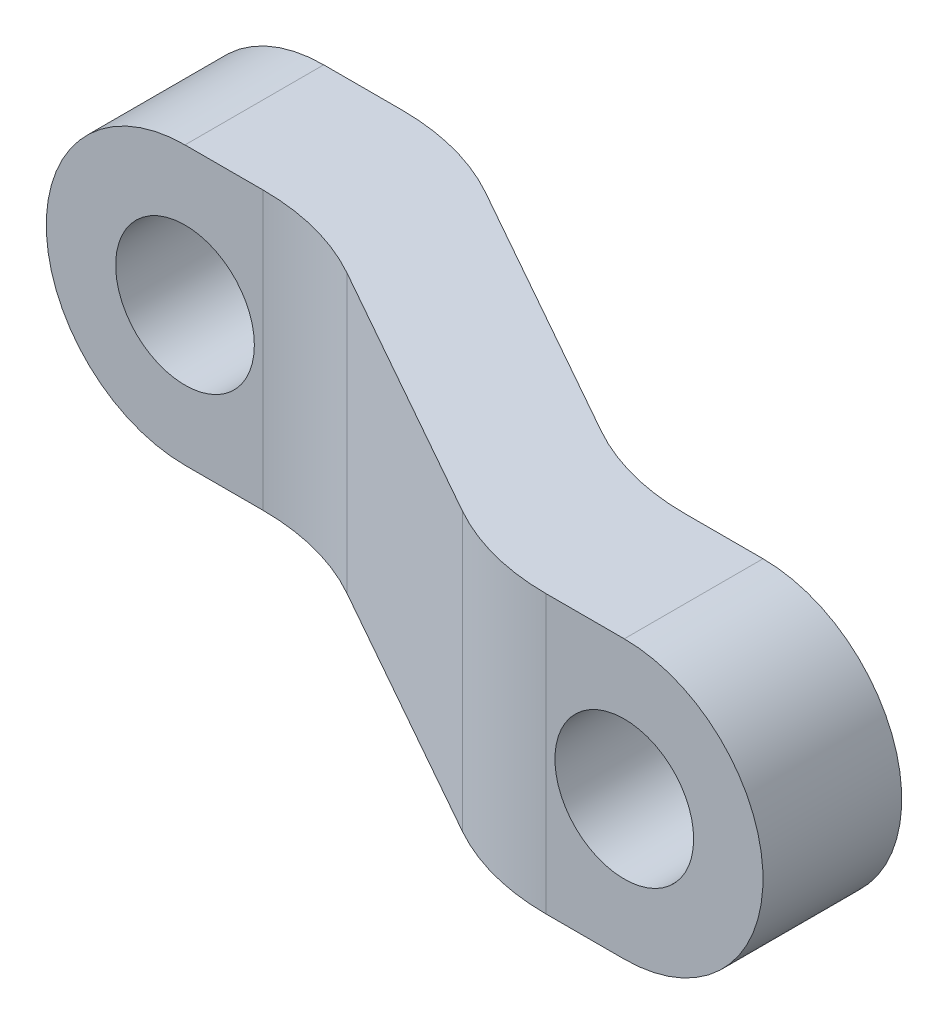
ISO-10303-21;
HEADER;
FILE_DESCRIPTION(('STEP AP214'),'2;1');
FILE_NAME('part.step','',(''),(''),'','','');
FILE_SCHEMA(('AUTOMOTIVE_DESIGN { 1 0 10303 214 1 1 1 1 }'));
ENDSEC;
DATA;
#1=APPLICATION_CONTEXT('core data for automotive mechanical design processes');
#2=APPLICATION_PROTOCOL_DEFINITION('international standard','automotive_design',2000,#1);
#3=PRODUCT_CONTEXT('',#1,'mechanical');
#4=PRODUCT('Part','Part','',(#3));
#5=PRODUCT_RELATED_PRODUCT_CATEGORY('part','',(#4));
#6=PRODUCT_DEFINITION_FORMATION('','',#4);
#7=PRODUCT_DEFINITION_CONTEXT('part definition',#1,'design');
#8=PRODUCT_DEFINITION('design','',#6,#7);
#9=PRODUCT_DEFINITION_SHAPE('','',#8);
#10=(LENGTH_UNIT() NAMED_UNIT(*) SI_UNIT(.MILLI.,.METRE.));
#11=(NAMED_UNIT(*) PLANE_ANGLE_UNIT() SI_UNIT($,.RADIAN.));
#12=(NAMED_UNIT(*) SI_UNIT($,.STERADIAN.) SOLID_ANGLE_UNIT());
#13=UNCERTAINTY_MEASURE_WITH_UNIT(LENGTH_MEASURE(1.E-05),#10,'distance_accuracy_value','');
#14=(GEOMETRIC_REPRESENTATION_CONTEXT(3) GLOBAL_UNCERTAINTY_ASSIGNED_CONTEXT((#13)) GLOBAL_UNIT_ASSIGNED_CONTEXT((#10,
#11,#12)) REPRESENTATION_CONTEXT('',''));
#15=CARTESIAN_POINT('',(0.,0.,0.));
#16=DIRECTION('',(0.,0.,1.));
#17=DIRECTION('',(1.,0.,0.));
#18=AXIS2_PLACEMENT_3D('',#15,#16,#17);
#19=CARTESIAN_POINT('',(0.,-3.,-3.));
#20=DIRECTION('',(0.,0.,1.));
#21=DIRECTION('',(1.,0.,0.));
#22=AXIS2_PLACEMENT_3D('',#19,#20,#21);
#23=PLANE('',#22);
#24=DIRECTION('',(1.,0.,0.));
#25=VECTOR('',#24,1.);
#26=CARTESIAN_POINT('',(0.,-3.,-3.));
#27=LINE('',#26,#25);
#28=CARTESIAN_POINT('',(-14.,-3.,-2.99999999999999));
#29=VERTEX_POINT('',#28);
#30=CARTESIAN_POINT('',(-12.3097554170477,-3.,-3.));
#31=VERTEX_POINT('',#30);
#32=EDGE_CURVE('E271',#29,#31,#27,.T.);
#33=ORIENTED_EDGE('',*,*,#32,.T.);
#34=DIRECTION('',(0.,1.,0.));
#35=VECTOR('',#34,1.);
#36=CARTESIAN_POINT('',(-12.3097554170477,3.,-3.));
#37=LINE('',#36,#35);
#38=CARTESIAN_POINT('',(-12.3097554170477,3.,-3.));
#39=VERTEX_POINT('',#38);
#40=EDGE_CURVE('E304',#31,#39,#37,.T.);
#41=ORIENTED_EDGE('',*,*,#40,.T.);
#42=DIRECTION('',(1.,0.,0.));
#43=VECTOR('',#42,1.);
#44=CARTESIAN_POINT('',(0.,3.,-3.));
#45=LINE('',#44,#43);
#46=CARTESIAN_POINT('',(-14.,3.,-3.));
#47=VERTEX_POINT('',#46);
#48=EDGE_CURVE('E251',#47,#39,#45,.T.);
#49=ORIENTED_EDGE('',*,*,#48,.F.);
#50=CARTESIAN_POINT('',(-14.,0.,-2.99999999999999));
#51=DIRECTION('',(0.,0.,1.));
#52=DIRECTION('',(1.,0.,0.));
#53=AXIS2_PLACEMENT_3D('',#50,#51,#52);
#54=CIRCLE('',#53,3.);
#55=EDGE_CURVE('E237',#29,#47,#54,.F.);
#56=ORIENTED_EDGE('',*,*,#55,.F.);
#57=EDGE_LOOP('',(#33,#41,#49,#56));
#58=FACE_BOUND('',#57,.T.);
#59=CARTESIAN_POINT('',(-14.,0.,-2.99999999999999));
#60=DIRECTION('',(0.,0.,1.));
#61=DIRECTION('',(1.,0.,0.));
#62=AXIS2_PLACEMENT_3D('',#59,#60,#61);
#63=CIRCLE('',#62,1.5);
#64=CARTESIAN_POINT('',(-12.5,0.,-3.));
#65=VERTEX_POINT('',#64);
#66=EDGE_CURVE('E246',#65,#65,#63,.F.);
#67=ORIENTED_EDGE('',*,*,#66,.T.);
#68=EDGE_LOOP('',(#67));
#69=FACE_BOUND('',#68,.T.);
#70=ADVANCED_FACE('F137',(#58,#69),#23,.T.);
#71=CARTESIAN_POINT('',(0.,-3.,-6.));
#72=DIRECTION('',(0.,0.,1.));
#73=DIRECTION('',(1.,0.,0.));
#74=AXIS2_PLACEMENT_3D('',#71,#72,#73);
#75=PLANE('',#74);
#76=CARTESIAN_POINT('',(-14.,0.,-6.));
#77=DIRECTION('',(0.,0.,1.));
#78=DIRECTION('',(1.,0.,0.));
#79=AXIS2_PLACEMENT_3D('',#76,#77,#78);
#80=CIRCLE('',#79,1.5);
#81=CARTESIAN_POINT('',(-12.5,0.,-6.));
#82=VERTEX_POINT('',#81);
#83=EDGE_CURVE('E529',#82,#82,#80,.T.);
#84=ORIENTED_EDGE('',*,*,#83,.T.);
#85=EDGE_LOOP('',(#84));
#86=FACE_BOUND('',#85,.T.);
#87=DIRECTION('',(1.,0.,0.));
#88=VECTOR('',#87,1.);
#89=CARTESIAN_POINT('',(0.,3.,-6.));
#90=LINE('',#89,#88);
#91=CARTESIAN_POINT('',(-14.,3.,-6.));
#92=VERTEX_POINT('',#91);
#93=CARTESIAN_POINT('',(-12.3097554170477,3.,-5.99999999999999));
#94=VERTEX_POINT('',#93);
#95=EDGE_CURVE('E231',#92,#94,#90,.T.);
#96=ORIENTED_EDGE('',*,*,#95,.T.);
#97=DIRECTION('',(0.,1.,0.));
#98=VECTOR('',#97,1.);
#99=CARTESIAN_POINT('',(-12.3097554170477,-3.,-5.99999999999999));
#100=LINE('',#99,#98);
#101=CARTESIAN_POINT('',(-12.3097554170477,-3.,-5.99999999999999));
#102=VERTEX_POINT('',#101);
#103=EDGE_CURVE('E299',#94,#102,#100,.F.);
#104=ORIENTED_EDGE('',*,*,#103,.T.);
#105=DIRECTION('',(1.,0.,0.));
#106=VECTOR('',#105,1.);
#107=CARTESIAN_POINT('',(0.,-3.,-6.));
#108=LINE('',#107,#106);
#109=CARTESIAN_POINT('',(-14.,-3.,-5.99999999999999));
#110=VERTEX_POINT('',#109);
#111=EDGE_CURVE('E234',#110,#102,#108,.T.);
#112=ORIENTED_EDGE('',*,*,#111,.F.);
#113=CARTESIAN_POINT('',(-14.,0.,-6.));
#114=DIRECTION('',(0.,0.,1.));
#115=DIRECTION('',(1.,0.,0.));
#116=AXIS2_PLACEMENT_3D('',#113,#114,#115);
#117=CIRCLE('',#116,3.);
#118=EDGE_CURVE('E227',#92,#110,#117,.T.);
#119=ORIENTED_EDGE('',*,*,#118,.F.);
#120=EDGE_LOOP('',(#96,#104,#112,#119));
#121=FACE_BOUND('',#120,.T.);
#122=ADVANCED_FACE('F229',(#86,#121),#75,.F.);
#123=CARTESIAN_POINT('',(0.,3.,0.));
#124=DIRECTION('',(0.,1.,0.));
#125=DIRECTION('',(0.,0.,1.));
#126=AXIS2_PLACEMENT_3D('',#123,#124,#125);
#127=PLANE('',#126);
#128=DIRECTION('',(0.871575537124549,0.,0.490261239632559));
#129=VECTOR('',#128,1.);
#130=CARTESIAN_POINT('',(-0.0801186943620185,3.,0.142433234421366));
#131=LINE('',#130,#129);
#132=CARTESIAN_POINT('',(-9.85844921888489,3.,-5.35787768562274));
#133=VERTEX_POINT('',#132);
#134=CARTESIAN_POINT('',(-4.14155078111512,3.,-2.14212231437725));
#135=VERTEX_POINT('',#134);
#136=EDGE_CURVE('E252',#133,#135,#131,.T.);
#137=ORIENTED_EDGE('',*,*,#136,.F.);
#138=CARTESIAN_POINT('',(-12.3097554170477,3.,-0.999999999999995));
#139=DIRECTION('',(0.,1.,0.));
#140=DIRECTION('',(0.,0.,1.));
#141=AXIS2_PLACEMENT_3D('',#138,#139,#140);
#142=CIRCLE('',#141,5.);
#143=EDGE_CURVE('E250',#133,#94,#142,.T.);
#144=ORIENTED_EDGE('',*,*,#143,.T.);
#145=ORIENTED_EDGE('',*,*,#95,.F.);
#146=DIRECTION('',(0.,0.,1.));
#147=VECTOR('',#146,1.);
#148=CARTESIAN_POINT('',(-14.,3.,-6.));
#149=LINE('',#148,#147);
#150=EDGE_CURVE('E238',#92,#47,#149,.T.);
#151=ORIENTED_EDGE('',*,*,#150,.T.);
#152=ORIENTED_EDGE('',*,*,#48,.T.);
#153=CARTESIAN_POINT('',(-12.3097554170477,3.,2.));
#154=DIRECTION('',(0.,1.,0.));
#155=DIRECTION('',(0.,0.,1.));
#156=AXIS2_PLACEMENT_3D('',#153,#154,#155);
#157=CIRCLE('',#156,5.);
#158=CARTESIAN_POINT('',(-9.85844921888488,3.,-2.35787768562274));
#159=VERTEX_POINT('',#158);
#160=EDGE_CURVE('E317',#39,#159,#157,.F.);
#161=ORIENTED_EDGE('',*,*,#160,.T.);
#162=DIRECTION('',(0.87157553712455,0.,0.490261239632559));
#163=VECTOR('',#162,1.);
#164=CARTESIAN_POINT('',(-1.3620178041543,3.,2.4213649851632));
#165=LINE('',#164,#163);
#166=CARTESIAN_POINT('',(-4.14155078111512,3.,0.857877685622748));
#167=VERTEX_POINT('',#166);
#168=EDGE_CURVE('E254',#159,#167,#165,.T.);
#169=ORIENTED_EDGE('',*,*,#168,.T.);
#170=CARTESIAN_POINT('',(-1.69024458295232,3.,-3.5));
#171=DIRECTION('',(0.,1.,0.));
#172=DIRECTION('',(0.,0.,1.));
#173=AXIS2_PLACEMENT_3D('',#170,#171,#172);
#174=CIRCLE('',#173,5.);
#175=CARTESIAN_POINT('',(-1.69024458295232,3.,1.5));
#176=VERTEX_POINT('',#175);
#177=EDGE_CURVE('E296',#167,#176,#174,.T.);
#178=ORIENTED_EDGE('',*,*,#177,.T.);
#179=DIRECTION('',(1.,0.,0.));
#180=VECTOR('',#179,1.);
#181=CARTESIAN_POINT('',(0.,3.,1.5));
#182=LINE('',#181,#180);
#183=CARTESIAN_POINT('',(0.,3.,1.5));
#184=VERTEX_POINT('',#183);
#185=EDGE_CURVE('E263',#176,#184,#182,.T.);
#186=ORIENTED_EDGE('',*,*,#185,.T.);
#187=DIRECTION('',(0.,0.,-1.));
#188=VECTOR('',#187,1.);
#189=CARTESIAN_POINT('',(0.,3.,3.));
#190=LINE('',#189,#188);
#191=CARTESIAN_POINT('',(0.,3.,-1.5));
#192=VERTEX_POINT('',#191);
#193=EDGE_CURVE('E279',#192,#184,#190,.F.);
#194=ORIENTED_EDGE('',*,*,#193,.F.);
#195=DIRECTION('',(1.,0.,0.));
#196=VECTOR('',#195,1.);
#197=CARTESIAN_POINT('',(0.,3.,-1.5));
#198=LINE('',#197,#196);
#199=CARTESIAN_POINT('',(-1.69024458295233,3.,-1.5));
#200=VERTEX_POINT('',#199);
#201=EDGE_CURVE('E265',#200,#192,#198,.T.);
#202=ORIENTED_EDGE('',*,*,#201,.F.);
#203=CARTESIAN_POINT('',(-1.69024458295233,3.,-6.5));
#204=DIRECTION('',(0.,1.,0.));
#205=DIRECTION('',(0.,0.,1.));
#206=AXIS2_PLACEMENT_3D('',#203,#204,#205);
#207=CIRCLE('',#206,5.);
#208=EDGE_CURVE('E145',#200,#135,#207,.F.);
#209=ORIENTED_EDGE('',*,*,#208,.T.);
#210=EDGE_LOOP('',(#137,#144,#145,#151,#152,#161,#169,#178,#186,#194,#202,#209));
#211=FACE_BOUND('',#210,.T.);
#212=ADVANCED_FACE('F249',(#211),#127,.T.);
#213=CARTESIAN_POINT('',(0.,-3.,0.));
#214=DIRECTION('',(0.,1.,0.));
#215=DIRECTION('',(0.,0.,1.));
#216=AXIS2_PLACEMENT_3D('',#213,#214,#215);
#217=PLANE('',#216);
#218=ORIENTED_EDGE('',*,*,#111,.T.);
#219=CARTESIAN_POINT('',(-12.3097554170477,-3.,-0.999999999999995));
#220=DIRECTION('',(0.,1.,0.));
#221=DIRECTION('',(0.,0.,1.));
#222=AXIS2_PLACEMENT_3D('',#219,#220,#221);
#223=CIRCLE('',#222,5.);
#224=CARTESIAN_POINT('',(-9.85844921888489,-3.,-5.35787768562274));
#225=VERTEX_POINT('',#224);
#226=EDGE_CURVE('E302',#102,#225,#223,.F.);
#227=ORIENTED_EDGE('',*,*,#226,.T.);
#228=DIRECTION('',(0.871575537124549,0.,0.490261239632559));
#229=VECTOR('',#228,1.);
#230=CARTESIAN_POINT('',(-0.0801186943620185,-3.,0.142433234421366));
#231=LINE('',#230,#229);
#232=CARTESIAN_POINT('',(-4.14155078111512,-3.,-2.14212231437725));
#233=VERTEX_POINT('',#232);
#234=EDGE_CURVE('E267',#225,#233,#231,.T.);
#235=ORIENTED_EDGE('',*,*,#234,.T.);
#236=CARTESIAN_POINT('',(-1.69024458295233,-3.,-6.5));
#237=DIRECTION('',(0.,1.,0.));
#238=DIRECTION('',(0.,0.,1.));
#239=AXIS2_PLACEMENT_3D('',#236,#237,#238);
#240=CIRCLE('',#239,5.);
#241=CARTESIAN_POINT('',(-1.69024458295233,-3.,-1.5));
#242=VERTEX_POINT('',#241);
#243=EDGE_CURVE('E12',#233,#242,#240,.T.);
#244=ORIENTED_EDGE('',*,*,#243,.T.);
#245=DIRECTION('',(1.,0.,0.));
#246=VECTOR('',#245,1.);
#247=CARTESIAN_POINT('',(0.,-3.,-1.5));
#248=LINE('',#247,#246);
#249=CARTESIAN_POINT('',(0.,-3.,-1.5));
#250=VERTEX_POINT('',#249);
#251=EDGE_CURVE('E277',#242,#250,#248,.T.);
#252=ORIENTED_EDGE('',*,*,#251,.T.);
#253=DIRECTION('',(0.,0.,1.));
#254=VECTOR('',#253,1.);
#255=CARTESIAN_POINT('',(0.,-3.,-3.));
#256=LINE('',#255,#254);
#257=CARTESIAN_POINT('',(0.,-3.,1.5));
#258=VERTEX_POINT('',#257);
#259=EDGE_CURVE('E282',#250,#258,#256,.T.);
#260=ORIENTED_EDGE('',*,*,#259,.T.);
#261=DIRECTION('',(1.,0.,0.));
#262=VECTOR('',#261,1.);
#263=CARTESIAN_POINT('',(0.,-3.,1.5));
#264=LINE('',#263,#262);
#265=CARTESIAN_POINT('',(-1.69024458295232,-3.,1.5));
#266=VERTEX_POINT('',#265);
#267=EDGE_CURVE('E275',#266,#258,#264,.T.);
#268=ORIENTED_EDGE('',*,*,#267,.F.);
#269=CARTESIAN_POINT('',(-1.69024458295232,-3.,-3.5));
#270=DIRECTION('',(0.,1.,0.));
#271=DIRECTION('',(0.,0.,1.));
#272=AXIS2_PLACEMENT_3D('',#269,#270,#271);
#273=CIRCLE('',#272,5.);
#274=CARTESIAN_POINT('',(-4.14155078111512,-3.,0.857877685622748));
#275=VERTEX_POINT('',#274);
#276=EDGE_CURVE('E158',#266,#275,#273,.F.);
#277=ORIENTED_EDGE('',*,*,#276,.T.);
#278=DIRECTION('',(0.87157553712455,0.,0.490261239632559));
#279=VECTOR('',#278,1.);
#280=CARTESIAN_POINT('',(-1.3620178041543,-3.,2.4213649851632));
#281=LINE('',#280,#279);
#282=CARTESIAN_POINT('',(-9.85844921888488,-3.,-2.35787768562274));
#283=VERTEX_POINT('',#282);
#284=EDGE_CURVE('E273',#283,#275,#281,.T.);
#285=ORIENTED_EDGE('',*,*,#284,.F.);
#286=CARTESIAN_POINT('',(-12.3097554170477,-3.,2.));
#287=DIRECTION('',(0.,1.,0.));
#288=DIRECTION('',(0.,0.,1.));
#289=AXIS2_PLACEMENT_3D('',#286,#287,#288);
#290=CIRCLE('',#289,5.);
#291=EDGE_CURVE('E152',#283,#31,#290,.T.);
#292=ORIENTED_EDGE('',*,*,#291,.T.);
#293=ORIENTED_EDGE('',*,*,#32,.F.);
#294=DIRECTION('',(0.,0.,-1.));
#295=VECTOR('',#294,1.);
#296=CARTESIAN_POINT('',(-14.,-3.,0.));
#297=LINE('',#296,#295);
#298=EDGE_CURVE('E285',#110,#29,#297,.F.);
#299=ORIENTED_EDGE('',*,*,#298,.F.);
#300=EDGE_LOOP('',(#218,#227,#235,#244,#252,#260,#268,#277,#285,#292,#293,#299));
#301=FACE_BOUND('',#300,.T.);
#302=ADVANCED_FACE('F330',(#301),#217,.F.);
#303=CARTESIAN_POINT('',(0.,-3.,1.5));
#304=DIRECTION('',(0.,0.,1.));
#305=DIRECTION('',(1.,0.,0.));
#306=AXIS2_PLACEMENT_3D('',#303,#304,#305);
#307=PLANE('',#306);
#308=ORIENTED_EDGE('',*,*,#185,.F.);
#309=DIRECTION('',(0.,1.,0.));
#310=VECTOR('',#309,1.);
#311=CARTESIAN_POINT('',(-1.69024458295232,-3.,1.5));
#312=LINE('',#311,#310);
#313=EDGE_CURVE('E312',#176,#266,#312,.F.);
#314=ORIENTED_EDGE('',*,*,#313,.T.);
#315=ORIENTED_EDGE('',*,*,#267,.T.);
#316=CARTESIAN_POINT('',(0.,0.,1.5));
#317=DIRECTION('',(0.,0.,1.));
#318=DIRECTION('',(1.,0.,0.));
#319=AXIS2_PLACEMENT_3D('',#316,#317,#318);
#320=CIRCLE('',#319,3.);
#321=EDGE_CURVE('E337',#184,#258,#320,.F.);
#322=ORIENTED_EDGE('',*,*,#321,.F.);
#323=EDGE_LOOP('',(#308,#314,#315,#322));
#324=FACE_BOUND('',#323,.T.);
#325=CARTESIAN_POINT('',(0.,0.,1.5));
#326=DIRECTION('',(0.,0.,1.));
#327=DIRECTION('',(1.,0.,0.));
#328=AXIS2_PLACEMENT_3D('',#325,#326,#327);
#329=CIRCLE('',#328,1.5);
#330=CARTESIAN_POINT('',(1.5,0.,1.5));
#331=VERTEX_POINT('',#330);
#332=EDGE_CURVE('E286',#331,#331,#329,.F.);
#333=ORIENTED_EDGE('',*,*,#332,.T.);
#334=EDGE_LOOP('',(#333));
#335=FACE_BOUND('',#334,.T.);
#336=ADVANCED_FACE('F384',(#324,#335),#307,.T.);
#337=CARTESIAN_POINT('',(0.,-3.,-1.5));
#338=DIRECTION('',(0.,0.,1.));
#339=DIRECTION('',(1.,0.,0.));
#340=AXIS2_PLACEMENT_3D('',#337,#338,#339);
#341=PLANE('',#340);
#342=CARTESIAN_POINT('',(0.,0.,-1.5));
#343=DIRECTION('',(0.,0.,1.));
#344=DIRECTION('',(1.,0.,0.));
#345=AXIS2_PLACEMENT_3D('',#342,#343,#344);
#346=CIRCLE('',#345,1.5);
#347=CARTESIAN_POINT('',(1.5,0.,-1.5));
#348=VERTEX_POINT('',#347);
#349=EDGE_CURVE('E289',#348,#348,#346,.F.);
#350=ORIENTED_EDGE('',*,*,#349,.F.);
#351=EDGE_LOOP('',(#350));
#352=FACE_BOUND('',#351,.T.);
#353=ORIENTED_EDGE('',*,*,#251,.F.);
#354=DIRECTION('',(0.,1.,0.));
#355=VECTOR('',#354,1.);
#356=CARTESIAN_POINT('',(-1.69024458295233,3.,-1.5));
#357=LINE('',#356,#355);
#358=EDGE_CURVE('E314',#242,#200,#357,.T.);
#359=ORIENTED_EDGE('',*,*,#358,.T.);
#360=ORIENTED_EDGE('',*,*,#201,.T.);
#361=CARTESIAN_POINT('',(0.,0.,-1.5));
#362=DIRECTION('',(0.,0.,1.));
#363=DIRECTION('',(1.,0.,0.));
#364=AXIS2_PLACEMENT_3D('',#361,#362,#363);
#365=CIRCLE('',#364,3.);
#366=EDGE_CURVE('E257',#192,#250,#365,.F.);
#367=ORIENTED_EDGE('',*,*,#366,.T.);
#368=EDGE_LOOP('',(#353,#359,#360,#367));
#369=FACE_BOUND('',#368,.T.);
#370=ADVANCED_FACE('F333',(#352,#369),#341,.F.);
#371=CARTESIAN_POINT('',(-0.0801186943620185,-3.,0.142433234421366));
#372=DIRECTION('',(-0.490261239632559,0.,0.871575537124549));
#373=DIRECTION('',(0.87157553712455,0.,0.490261239632559));
#374=AXIS2_PLACEMENT_3D('',#371,#372,#373);
#375=PLANE('',#374);
#376=ORIENTED_EDGE('',*,*,#234,.F.);
#377=DIRECTION('',(0.,1.,0.));
#378=VECTOR('',#377,1.);
#379=CARTESIAN_POINT('',(-9.85844921888488,-3.,-5.35787768562274));
#380=LINE('',#379,#378);
#381=EDGE_CURVE('E293',#225,#133,#380,.T.);
#382=ORIENTED_EDGE('',*,*,#381,.T.);
#383=ORIENTED_EDGE('',*,*,#136,.T.);
#384=DIRECTION('',(0.,1.,0.));
#385=VECTOR('',#384,1.);
#386=CARTESIAN_POINT('',(-4.14155078111512,-3.,-2.14212231437725));
#387=LINE('',#386,#385);
#388=EDGE_CURVE('E291',#135,#233,#387,.F.);
#389=ORIENTED_EDGE('',*,*,#388,.T.);
#390=EDGE_LOOP('',(#376,#382,#383,#389));
#391=FACE_BOUND('',#390,.T.);
#392=ADVANCED_FACE('F326',(#391),#375,.F.);
#393=CARTESIAN_POINT('',(-1.3620178041543,-3.,2.4213649851632));
#394=DIRECTION('',(-0.490261239632559,0.,0.871575537124549));
#395=DIRECTION('',(0.87157553712455,0.,0.490261239632559));
#396=AXIS2_PLACEMENT_3D('',#393,#394,#395);
#397=PLANE('',#396);
#398=ORIENTED_EDGE('',*,*,#168,.F.);
#399=DIRECTION('',(0.,1.,0.));
#400=VECTOR('',#399,1.);
#401=CARTESIAN_POINT('',(-9.85844921888488,-3.,-2.35787768562274));
#402=LINE('',#401,#400);
#403=EDGE_CURVE('E310',#159,#283,#402,.F.);
#404=ORIENTED_EDGE('',*,*,#403,.T.);
#405=ORIENTED_EDGE('',*,*,#284,.T.);
#406=DIRECTION('',(0.,1.,0.));
#407=VECTOR('',#406,1.);
#408=CARTESIAN_POINT('',(-4.14155078111512,-3.,0.857877685622749));
#409=LINE('',#408,#407);
#410=EDGE_CURVE('E307',#275,#167,#409,.T.);
#411=ORIENTED_EDGE('',*,*,#410,.T.);
#412=EDGE_LOOP('',(#398,#404,#405,#411));
#413=FACE_BOUND('',#412,.T.);
#414=ADVANCED_FACE('F348',(#413),#397,.T.);
#415=CARTESIAN_POINT('',(0.,0.,3.));
#416=DIRECTION('',(0.,0.,-1.));
#417=DIRECTION('',(-1.,0.,0.));
#418=AXIS2_PLACEMENT_3D('',#415,#416,#417);
#419=CYLINDRICAL_SURFACE('',#418,3.);
#420=ORIENTED_EDGE('',*,*,#193,.T.);
#421=ORIENTED_EDGE('',*,*,#321,.T.);
#422=ORIENTED_EDGE('',*,*,#259,.F.);
#423=ORIENTED_EDGE('',*,*,#366,.F.);
#424=EDGE_LOOP('',(#420,#421,#422,#423));
#425=FACE_BOUND('',#424,.T.);
#426=ADVANCED_FACE('F339',(#425),#419,.T.);
#427=CARTESIAN_POINT('',(0.,0.,3.));
#428=DIRECTION('',(0.,0.,-1.));
#429=DIRECTION('',(-1.,0.,0.));
#430=AXIS2_PLACEMENT_3D('',#427,#428,#429);
#431=CYLINDRICAL_SURFACE('',#430,1.5);
#432=ORIENTED_EDGE('',*,*,#332,.F.);
#433=EDGE_LOOP('',(#432));
#434=FACE_BOUND('',#433,.T.);
#435=ORIENTED_EDGE('',*,*,#349,.T.);
#436=EDGE_LOOP('',(#435));
#437=FACE_BOUND('',#436,.T.);
#438=ADVANCED_FACE('F398',(#434,#437),#431,.F.);
#439=CARTESIAN_POINT('',(-14.,0.,0.));
#440=DIRECTION('',(0.,0.,-1.));
#441=DIRECTION('',(-1.,0.,0.));
#442=AXIS2_PLACEMENT_3D('',#439,#440,#441);
#443=CYLINDRICAL_SURFACE('',#442,3.);
#444=ORIENTED_EDGE('',*,*,#55,.T.);
#445=ORIENTED_EDGE('',*,*,#150,.F.);
#446=ORIENTED_EDGE('',*,*,#118,.T.);
#447=ORIENTED_EDGE('',*,*,#298,.T.);
#448=EDGE_LOOP('',(#444,#445,#446,#447));
#449=FACE_BOUND('',#448,.T.);
#450=ADVANCED_FACE('F241',(#449),#443,.T.);
#451=CARTESIAN_POINT('',(-14.,0.,0.));
#452=DIRECTION('',(0.,0.,-1.));
#453=DIRECTION('',(-1.,0.,0.));
#454=AXIS2_PLACEMENT_3D('',#451,#452,#453);
#455=CYLINDRICAL_SURFACE('',#454,1.5);
#456=ORIENTED_EDGE('',*,*,#66,.F.);
#457=EDGE_LOOP('',(#456));
#458=FACE_BOUND('',#457,.T.);
#459=ORIENTED_EDGE('',*,*,#83,.F.);
#460=EDGE_LOOP('',(#459));
#461=FACE_BOUND('',#460,.T.);
#462=ADVANCED_FACE('F360',(#458,#461),#455,.F.);
#463=CARTESIAN_POINT('',(-12.3097554170477,-3.,-0.999999999999995));
#464=DIRECTION('',(0.,1.,0.));
#465=DIRECTION('',(0.,0.,1.));
#466=AXIS2_PLACEMENT_3D('',#463,#464,#465);
#467=CYLINDRICAL_SURFACE('',#466,5.);
#468=ORIENTED_EDGE('',*,*,#226,.F.);
#469=ORIENTED_EDGE('',*,*,#103,.F.);
#470=ORIENTED_EDGE('',*,*,#143,.F.);
#471=ORIENTED_EDGE('',*,*,#381,.F.);
#472=EDGE_LOOP('',(#468,#469,#470,#471));
#473=FACE_BOUND('',#472,.T.);
#474=ADVANCED_FACE('F358',(#473),#467,.T.);
#475=CARTESIAN_POINT('',(-12.3097554170477,-3.,2.));
#476=DIRECTION('',(0.,-1.,0.));
#477=DIRECTION('',(0.,0.,-1.));
#478=AXIS2_PLACEMENT_3D('',#475,#476,#477);
#479=CYLINDRICAL_SURFACE('',#478,5.);
#480=ORIENTED_EDGE('',*,*,#291,.F.);
#481=ORIENTED_EDGE('',*,*,#403,.F.);
#482=ORIENTED_EDGE('',*,*,#160,.F.);
#483=ORIENTED_EDGE('',*,*,#40,.F.);
#484=EDGE_LOOP('',(#480,#481,#482,#483));
#485=FACE_BOUND('',#484,.T.);
#486=ADVANCED_FACE('F353',(#485),#479,.F.);
#487=CARTESIAN_POINT('',(-1.69024458295232,-3.,-3.5));
#488=DIRECTION('',(0.,1.,0.));
#489=DIRECTION('',(0.,0.,1.));
#490=AXIS2_PLACEMENT_3D('',#487,#488,#489);
#491=CYLINDRICAL_SURFACE('',#490,5.);
#492=ORIENTED_EDGE('',*,*,#276,.F.);
#493=ORIENTED_EDGE('',*,*,#313,.F.);
#494=ORIENTED_EDGE('',*,*,#177,.F.);
#495=ORIENTED_EDGE('',*,*,#410,.F.);
#496=EDGE_LOOP('',(#492,#493,#494,#495));
#497=FACE_BOUND('',#496,.T.);
#498=ADVANCED_FACE('F345',(#497),#491,.T.);
#499=CARTESIAN_POINT('',(-1.69024458295233,-3.,-6.5));
#500=DIRECTION('',(0.,-1.,0.));
#501=DIRECTION('',(0.,0.,-1.));
#502=AXIS2_PLACEMENT_3D('',#499,#500,#501);
#503=CYLINDRICAL_SURFACE('',#502,5.);
#504=ORIENTED_EDGE('',*,*,#243,.F.);
#505=ORIENTED_EDGE('',*,*,#388,.F.);
#506=ORIENTED_EDGE('',*,*,#208,.F.);
#507=ORIENTED_EDGE('',*,*,#358,.F.);
#508=EDGE_LOOP('',(#504,#505,#506,#507));
#509=FACE_BOUND('',#508,.T.);
#510=ADVANCED_FACE('F139',(#509),#503,.F.);
#511=CLOSED_SHELL('',(#70,#122,#212,#302,#336,#370,#392,#414,#426,#438,#450,#462,#474,#486,#498,#510));
#512=MANIFOLD_SOLID_BREP('B2',#511);
#513=ADVANCED_BREP_SHAPE_REPRESENTATION('',(#18,#512),#14);
#514=SHAPE_DEFINITION_REPRESENTATION(#9,#513);
ENDSEC;
END-ISO-10303-21;
